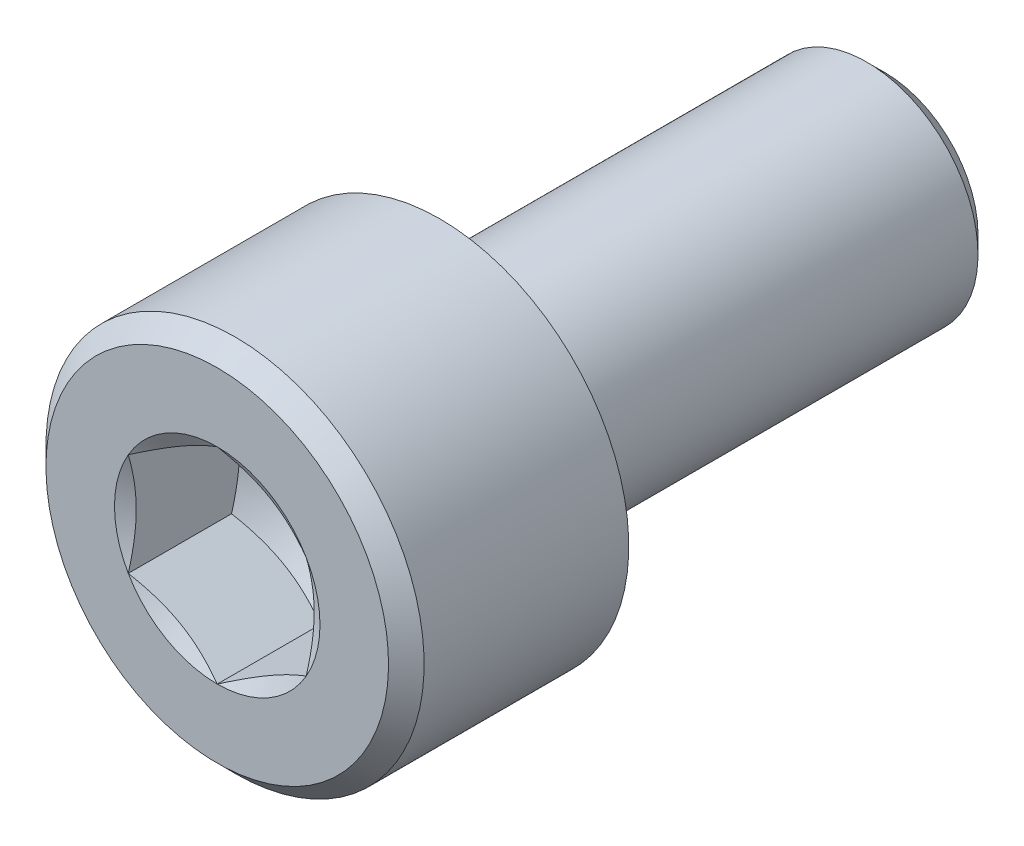
ISO-10303-21;
HEADER;
FILE_DESCRIPTION(('STEP AP214'),'2;1');
FILE_NAME('part.step','',(''),(''),'','','');
FILE_SCHEMA(('AUTOMOTIVE_DESIGN { 1 0 10303 214 1 1 1 1 }'));
ENDSEC;
DATA;
#1=APPLICATION_CONTEXT('core data for automotive mechanical design processes');
#2=APPLICATION_PROTOCOL_DEFINITION('international standard','automotive_design',2000,#1);
#3=PRODUCT_CONTEXT('',#1,'mechanical');
#4=PRODUCT('Part','Part','',(#3));
#5=PRODUCT_RELATED_PRODUCT_CATEGORY('part','',(#4));
#6=PRODUCT_DEFINITION_FORMATION('','',#4);
#7=PRODUCT_DEFINITION_CONTEXT('part definition',#1,'design');
#8=PRODUCT_DEFINITION('design','',#6,#7);
#9=PRODUCT_DEFINITION_SHAPE('','',#8);
#10=(LENGTH_UNIT() NAMED_UNIT(*) SI_UNIT(.MILLI.,.METRE.));
#11=(NAMED_UNIT(*) PLANE_ANGLE_UNIT() SI_UNIT($,.RADIAN.));
#12=(NAMED_UNIT(*) SI_UNIT($,.STERADIAN.) SOLID_ANGLE_UNIT());
#13=UNCERTAINTY_MEASURE_WITH_UNIT(LENGTH_MEASURE(1.E-05),#10,'distance_accuracy_value','');
#14=(GEOMETRIC_REPRESENTATION_CONTEXT(3) GLOBAL_UNCERTAINTY_ASSIGNED_CONTEXT((#13)) GLOBAL_UNIT_ASSIGNED_CONTEXT((#10,
#11,#12)) REPRESENTATION_CONTEXT('',''));
#15=CARTESIAN_POINT('',(0.,0.,0.));
#16=DIRECTION('',(0.,0.,1.));
#17=DIRECTION('',(1.,0.,0.));
#18=AXIS2_PLACEMENT_3D('',#15,#16,#17);
#19=CARTESIAN_POINT('',(0.,4.25,5.));
#20=DIRECTION('',(0.,0.,-1.));
#21=DIRECTION('',(0.,1.,0.));
#22=AXIS2_PLACEMENT_3D('',#19,#20,#21);
#23=PLANE('',#22);
#24=CARTESIAN_POINT('',(0.,0.,5.));
#25=DIRECTION('',(0.,0.,-1.));
#26=DIRECTION('',(0.,1.,0.));
#27=AXIS2_PLACEMENT_3D('',#24,#25,#26);
#28=CIRCLE('',#27,3.85);
#29=CARTESIAN_POINT('',(0.,3.85,5.));
#30=VERTEX_POINT('',#29);
#31=EDGE_CURVE('E283',#30,#30,#28,.F.);
#32=ORIENTED_EDGE('',*,*,#31,.T.);
#33=EDGE_LOOP('',(#32));
#34=FACE_BOUND('',#33,.T.);
#35=CARTESIAN_POINT('',(0.,0.,5.));
#36=DIRECTION('',(0.,0.,-1.));
#37=DIRECTION('',(0.,1.,0.));
#38=AXIS2_PLACEMENT_3D('',#35,#36,#37);
#39=CIRCLE('',#38,2.3094010767585);
#40=CARTESIAN_POINT('',(0.,2.3094010767585,5.));
#41=VERTEX_POINT('',#40);
#42=CARTESIAN_POINT('',(-2.,1.15470053837925,5.));
#43=VERTEX_POINT('',#42);
#44=EDGE_CURVE('E107',#41,#43,#39,.F.);
#45=ORIENTED_EDGE('',*,*,#44,.F.);
#46=CARTESIAN_POINT('',(2.,1.15470053837925,5.));
#47=VERTEX_POINT('',#46);
#48=EDGE_CURVE('E96',#47,#41,#39,.F.);
#49=ORIENTED_EDGE('',*,*,#48,.F.);
#50=CARTESIAN_POINT('',(2.,-1.15470053837925,5.));
#51=VERTEX_POINT('',#50);
#52=EDGE_CURVE('E105',#51,#47,#39,.F.);
#53=ORIENTED_EDGE('',*,*,#52,.F.);
#54=CARTESIAN_POINT('',(0.,-2.3094010767585,5.));
#55=VERTEX_POINT('',#54);
#56=EDGE_CURVE('E448',#55,#51,#39,.F.);
#57=ORIENTED_EDGE('',*,*,#56,.F.);
#58=CARTESIAN_POINT('',(-2.,-1.15470053838001,4.99999999999948));
#59=VERTEX_POINT('',#58);
#60=EDGE_CURVE('E135',#59,#55,#39,.F.);
#61=ORIENTED_EDGE('',*,*,#60,.F.);
#62=EDGE_CURVE('E134',#43,#59,#39,.F.);
#63=ORIENTED_EDGE('',*,*,#62,.F.);
#64=EDGE_LOOP('',(#45,#49,#53,#57,#61,#63));
#65=FACE_BOUND('',#64,.T.);
#66=ADVANCED_FACE('F40',(#34,#65),#23,.F.);
#67=CARTESIAN_POINT('',(0.,2.5,0.));
#68=DIRECTION('',(0.,0.,1.));
#69=DIRECTION('',(0.,-1.,0.));
#70=AXIS2_PLACEMENT_3D('',#67,#68,#69);
#71=PLANE('',#70);
#72=CARTESIAN_POINT('',(0.,0.,0.));
#73=DIRECTION('',(0.,0.,1.));
#74=DIRECTION('',(0.,-1.,0.));
#75=AXIS2_PLACEMENT_3D('',#72,#73,#74);
#76=CIRCLE('',#75,2.7);
#77=CARTESIAN_POINT('',(0.,-2.7,0.));
#78=VERTEX_POINT('',#77);
#79=EDGE_CURVE('E48',#78,#78,#76,.T.);
#80=ORIENTED_EDGE('',*,*,#79,.T.);
#81=EDGE_LOOP('',(#80));
#82=FACE_BOUND('',#81,.T.);
#83=CARTESIAN_POINT('',(0.,0.,0.));
#84=DIRECTION('',(0.,0.,1.));
#85=DIRECTION('',(0.,-1.,0.));
#86=AXIS2_PLACEMENT_3D('',#83,#84,#85);
#87=CIRCLE('',#86,4.25);
#88=CARTESIAN_POINT('',(0.,-4.25,0.));
#89=VERTEX_POINT('',#88);
#90=EDGE_CURVE('E427',#89,#89,#87,.T.);
#91=ORIENTED_EDGE('',*,*,#90,.F.);
#92=EDGE_LOOP('',(#91));
#93=FACE_BOUND('',#92,.T.);
#94=ADVANCED_FACE('F245',(#82,#93),#71,.F.);
#95=CARTESIAN_POINT('',(0.,0.,5.));
#96=DIRECTION('',(0.,0.,1.));
#97=DIRECTION('',(0.,-1.,0.));
#98=AXIS2_PLACEMENT_3D('',#95,#96,#97);
#99=CYLINDRICAL_SURFACE('',#98,2.5);
#100=CARTESIAN_POINT('',(0.,0.,-0.2));
#101=DIRECTION('',(0.,0.,1.));
#102=DIRECTION('',(0.,-1.,0.));
#103=AXIS2_PLACEMENT_3D('',#100,#101,#102);
#104=CIRCLE('',#103,2.5);
#105=CARTESIAN_POINT('',(0.,-2.5,-0.2));
#106=VERTEX_POINT('',#105);
#107=EDGE_CURVE('E12',#106,#106,#104,.F.);
#108=ORIENTED_EDGE('',*,*,#107,.T.);
#109=EDGE_LOOP('',(#108));
#110=FACE_BOUND('',#109,.T.);
#111=CARTESIAN_POINT('',(0.,0.,-9.6));
#112=DIRECTION('',(0.,0.,1.));
#113=DIRECTION('',(0.,-1.,0.));
#114=AXIS2_PLACEMENT_3D('',#111,#112,#113);
#115=CIRCLE('',#114,2.5);
#116=CARTESIAN_POINT('',(0.,-2.5,-9.6));
#117=VERTEX_POINT('',#116);
#118=EDGE_CURVE('E277',#117,#117,#115,.T.);
#119=ORIENTED_EDGE('',*,*,#118,.T.);
#120=EDGE_LOOP('',(#119));
#121=FACE_BOUND('',#120,.T.);
#122=ADVANCED_FACE('F250',(#110,#121),#99,.T.);
#123=CARTESIAN_POINT('',(0.,0.,-10.));
#124=DIRECTION('',(0.,0.,1.));
#125=DIRECTION('',(0.,-1.,0.));
#126=AXIS2_PLACEMENT_3D('',#123,#124,#125);
#127=PLANE('',#126);
#128=CARTESIAN_POINT('',(0.,0.,-10.));
#129=DIRECTION('',(0.,0.,1.));
#130=DIRECTION('',(0.,-1.,0.));
#131=AXIS2_PLACEMENT_3D('',#128,#129,#130);
#132=CIRCLE('',#131,2.1);
#133=CARTESIAN_POINT('',(0.,-2.1,-10.));
#134=VERTEX_POINT('',#133);
#135=EDGE_CURVE('E117',#134,#134,#132,.F.);
#136=ORIENTED_EDGE('',*,*,#135,.T.);
#137=EDGE_LOOP('',(#136));
#138=FACE_BOUND('',#137,.T.);
#139=ADVANCED_FACE('F255',(#138),#127,.F.);
#140=CARTESIAN_POINT('',(0.,0.,5.));
#141=DIRECTION('',(0.,0.,1.));
#142=DIRECTION('',(0.,-1.,0.));
#143=AXIS2_PLACEMENT_3D('',#140,#141,#142);
#144=CYLINDRICAL_SURFACE('',#143,4.25);
#145=CARTESIAN_POINT('',(0.,0.,4.6));
#146=DIRECTION('',(0.,0.,-1.));
#147=DIRECTION('',(0.,1.,0.));
#148=AXIS2_PLACEMENT_3D('',#145,#146,#147);
#149=CIRCLE('',#148,4.25);
#150=CARTESIAN_POINT('',(0.,4.25,4.6));
#151=VERTEX_POINT('',#150);
#152=EDGE_CURVE('E279',#151,#151,#149,.T.);
#153=ORIENTED_EDGE('',*,*,#152,.T.);
#154=EDGE_LOOP('',(#153));
#155=FACE_BOUND('',#154,.T.);
#156=ORIENTED_EDGE('',*,*,#90,.T.);
#157=EDGE_LOOP('',(#156));
#158=FACE_BOUND('',#157,.T.);
#159=ADVANCED_FACE('F169',(#155,#158),#144,.T.);
#160=CARTESIAN_POINT('',(0.,0.,5.));
#161=DIRECTION('',(0.,0.,-1.));
#162=DIRECTION('',(0.,1.,0.));
#163=AXIS2_PLACEMENT_3D('',#160,#161,#162);
#164=CONICAL_SURFACE('',#163,3.85,0.785398163397448);
#165=ORIENTED_EDGE('',*,*,#152,.F.);
#166=EDGE_LOOP('',(#165));
#167=FACE_BOUND('',#166,.T.);
#168=ORIENTED_EDGE('',*,*,#31,.F.);
#169=EDGE_LOOP('',(#168));
#170=FACE_BOUND('',#169,.T.);
#171=ADVANCED_FACE('F262',(#167,#170),#164,.T.);
#172=CARTESIAN_POINT('',(0.,0.,-9.6));
#173=DIRECTION('',(0.,0.,1.));
#174=DIRECTION('',(0.,-1.,0.));
#175=AXIS2_PLACEMENT_3D('',#172,#173,#174);
#176=CONICAL_SURFACE('',#175,2.5,0.785398163397448);
#177=ORIENTED_EDGE('',*,*,#135,.F.);
#178=EDGE_LOOP('',(#177));
#179=FACE_BOUND('',#178,.T.);
#180=ORIENTED_EDGE('',*,*,#118,.F.);
#181=EDGE_LOOP('',(#180));
#182=FACE_BOUND('',#181,.T.);
#183=ADVANCED_FACE('F264',(#179,#182),#176,.T.);
#184=CARTESIAN_POINT('',(0.,0.,4.82136720504592));
#185=DIRECTION('',(0.,0.,1.));
#186=DIRECTION('',(0.,-1.,0.));
#187=AXIS2_PLACEMENT_3D('',#184,#185,#186);
#188=CONICAL_SURFACE('',#187,2.,1.04719755119659);
#189=ORIENTED_EDGE('',*,*,#44,.T.);
#190=CARTESIAN_POINT('',(-2.0002,1.15458506832541,5.00006667166642));
#191=CARTESIAN_POINT('',(-1.91230873709994,1.20532911262018,4.9707567411466));
#192=CARTESIAN_POINT('',(-1.82365880552641,1.2565111744778,4.94410005702638));
#193=CARTESIAN_POINT('',(-1.6448237530022,1.35976164019319,4.89756969606664));
#194=CARTESIAN_POINT('',(-1.55463545349496,1.41183187919145,4.8777124814287));
#195=CARTESIAN_POINT('',(-1.37537661423669,1.51532701829183,4.84680066906917));
#196=CARTESIAN_POINT('',(-1.28633366177369,1.56673599086578,4.83554035664445));
#197=CARTESIAN_POINT('',(-1.10782860221495,1.66979593505373,4.82209586764056));
#198=CARTESIAN_POINT('',(-1.01836714429604,1.72144653186531,4.81990055999939));
#199=CARTESIAN_POINT('',(-0.851191646451199,1.81796535054794,4.82445819437657));
#200=CARTESIAN_POINT('',(-0.773452629734214,1.86284799277603,4.83009207973293));
#201=CARTESIAN_POINT('',(-0.618481085463865,1.95232085557725,4.84795110030674));
#202=CARTESIAN_POINT('',(-0.5412490942588,1.99691076648954,4.86018234106936));
#203=CARTESIAN_POINT('',(-0.385957813517798,2.08656822922816,4.89076064191353));
#204=CARTESIAN_POINT('',(-0.307918186892619,2.13162442866767,4.90923737211163));
#205=CARTESIAN_POINT('',(-0.153003134307864,2.221064675979,4.95117272325877));
#206=CARTESIAN_POINT('',(-0.0761257223768791,2.26544987045196,4.97462148553823));
#207=CARTESIAN_POINT('',(0.000200000000000249,2.30951654681234,5.00006667166642));
#208=B_SPLINE_CURVE_WITH_KNOTS('',3,(#190,#191,#192,#193,#194,#195,#196,#197,#198,#199,#200,
#201,#202,#203,#204,#205,#206,#207),.UNSPECIFIED.,.F.,.F.,(4,2,2,2,2,2,2,2,4),(0.,
0.317031824695611,0.634825876346565,0.944753967652638,1.25430138000371,1.52387047293094,
1.79368946861028,2.06949491027634,2.34475850821472),.UNSPECIFIED.);
#209=EDGE_CURVE('E111',#43,#41,#208,.T.);
#210=ORIENTED_EDGE('',*,*,#209,.T.);
#211=EDGE_LOOP('',(#189,#210));
#212=FACE_BOUND('',#211,.T.);
#213=ADVANCED_FACE('F112',(#212),#188,.F.);
#214=ORIENTED_EDGE('',*,*,#62,.T.);
#215=CARTESIAN_POINT('',(-2.,-3.06243599497982,5.77842061566642));
#216=CARTESIAN_POINT('',(-2.,-2.97462468513237,5.73598534037855));
#217=CARTESIAN_POINT('',(-2.,-2.8866057604461,5.69397190692429));
#218=CARTESIAN_POINT('',(-2.,-2.71004042392081,5.61102977847017));
#219=CARTESIAN_POINT('',(-2.,-2.62149392396137,5.57010127128071));
#220=CARTESIAN_POINT('',(-2.,-2.44328285837027,5.48935443652405));
#221=CARTESIAN_POINT('',(-2.,-2.35361479423054,5.44954380239757));
#222=CARTESIAN_POINT('',(-2.,-2.17354167395326,5.37163249793622));
#223=CARTESIAN_POINT('',(-2.,-2.08313665652268,5.33353173846879));
#224=CARTESIAN_POINT('',(-2.,-1.90031404940518,5.25903866540815));
#225=CARTESIAN_POINT('',(-2.,-1.80788540023466,5.22267334527037));
#226=CARTESIAN_POINT('',(-2.,-1.62195694964792,5.15279841056111));
#227=CARTESIAN_POINT('',(-2.,-1.52845725096689,5.11928852465543));
#228=CARTESIAN_POINT('',(-2.,-1.34040158791164,5.05601308267316));
#229=CARTESIAN_POINT('',(-2.,-1.24584820361364,5.02623993698969));
#230=CARTESIAN_POINT('',(-2.,-1.05539728812572,4.97140886877109));
#231=CARTESIAN_POINT('',(-2.,-0.959500192348852,4.9463494551145));
#232=CARTESIAN_POINT('',(-2.,-0.766296107056456,4.90216265730743));
#233=CARTESIAN_POINT('',(-2.,-0.668988749343329,4.88303685263621));
#234=CARTESIAN_POINT('',(-2.,-0.473201573751928,4.85200411839497));
#235=CARTESIAN_POINT('',(-2.,-0.374721754837131,4.84009719520736));
#236=CARTESIAN_POINT('',(-2.,-0.177725213014713,4.82455887040561));
#237=CARTESIAN_POINT('',(-2.,-0.0792127464698447,4.82087507810294));
#238=CARTESIAN_POINT('',(-2.,0.117733134481305,4.82196641552875));
#239=CARTESIAN_POINT('',(-2.,0.216166562770808,4.82673934949201));
#240=CARTESIAN_POINT('',(-2.,0.454297223247877,4.84809151895791));
#241=CARTESIAN_POINT('',(-2.,0.593620477818274,4.86885014693494));
#242=CARTESIAN_POINT('',(-2.,0.869689306254475,4.92356669931653));
#243=CARTESIAN_POINT('',(-2.,1.0064316481799,4.95754015317004));
#244=CARTESIAN_POINT('',(-2.,1.21108706615361,5.01612615070118));
#245=CARTESIAN_POINT('',(-2.,1.28004655189467,5.03722438207838));
#246=CARTESIAN_POINT('',(-2.,1.41724192464536,5.08150928917413));
#247=CARTESIAN_POINT('',(-2.,1.48547827495712,5.10469452442695));
#248=CARTESIAN_POINT('',(-2.,1.62094688255316,5.15267011301775));
#249=CARTESIAN_POINT('',(-2.,1.68818262968716,5.17745069711938));
#250=CARTESIAN_POINT('',(-2.,1.82213246587595,5.22846635273238));
#251=CARTESIAN_POINT('',(-2.,1.88884633148524,5.25470201209809));
#252=CARTESIAN_POINT('',(-2.,1.95531849493301,5.28152170831665));
#253=B_SPLINE_CURVE_WITH_KNOTS('',3,(#215,#216,#217,#218,#219,#220,#221,#222,#223,#224,#225,
#226,#227,#228,#229,#230,#231,#232,#233,#234,#235,#236,#237,#238,#239,#240,#241,#242,#243,#244,
#245,#246,#247,#248,#249,#250,#251,#252),.UNSPECIFIED.,.F.,.F.,(4,2,2,2,2,2,2,2,2,2,2,2,2,2,2,2,
2,2,4),(0.,0.292585896266147,0.585222115299657,0.879532973229982,1.17382847142418,
1.47176772581364,1.76967863724015,2.06697432467472,2.36417580814409,2.66145633652598,
2.95873712774083,3.25411843045697,3.54942304948623,3.97114178181696,4.39335760296185,
4.60967655565112,4.82584733174414,5.04080135347748,5.25584285892494),.UNSPECIFIED.);
#254=EDGE_CURVE('E227',#59,#43,#253,.T.);
#255=ORIENTED_EDGE('',*,*,#254,.T.);
#256=EDGE_LOOP('',(#214,#255));
#257=FACE_BOUND('',#256,.T.);
#258=ADVANCED_FACE('F271',(#257),#188,.F.);
#259=ORIENTED_EDGE('',*,*,#60,.T.);
#260=CARTESIAN_POINT('',(0.000200000000000642,-2.30951654681234,5.00006667166642));
#261=CARTESIAN_POINT('',(-0.0876912629000597,-2.25877250251757,4.9707567411466));
#262=CARTESIAN_POINT('',(-0.176341194473591,-2.20759044065995,4.94410005702638));
#263=CARTESIAN_POINT('',(-0.355176246997802,-2.10433997494456,4.89756969606664));
#264=CARTESIAN_POINT('',(-0.445364546505037,-2.0522697359463,4.8777124814287));
#265=CARTESIAN_POINT('',(-0.624623385763307,-1.94877459684592,4.84680066906917));
#266=CARTESIAN_POINT('',(-0.713666338226305,-1.89736562427197,4.83554035664445));
#267=CARTESIAN_POINT('',(-0.892171397785044,-1.79430568008402,4.82209586764056));
#268=CARTESIAN_POINT('',(-0.981632855703959,-1.74265508327244,4.81990055999938));
#269=CARTESIAN_POINT('',(-1.1488083535488,-1.64613626458981,4.82445819437656));
#270=CARTESIAN_POINT('',(-1.22654737026578,-1.60125362236172,4.83009207973293));
#271=CARTESIAN_POINT('',(-1.38151891453613,-1.51178075956051,4.84795110030675));
#272=CARTESIAN_POINT('',(-1.4587509057412,-1.46719084864821,4.86018234106936));
#273=CARTESIAN_POINT('',(-1.6140421864822,-1.37753338590959,4.89076064191353));
#274=CARTESIAN_POINT('',(-1.69208181310738,-1.33247718647009,4.90923737211163));
#275=CARTESIAN_POINT('',(-1.84699686569213,-1.24303693915875,4.95117272325877));
#276=CARTESIAN_POINT('',(-1.92387427762312,-1.1986517446858,4.97462148553823));
#277=CARTESIAN_POINT('',(-2.0002,-1.15458506832541,5.00006667166642));
#278=B_SPLINE_CURVE_WITH_KNOTS('',3,(#260,#261,#262,#263,#264,#265,#266,#267,#268,#269,#270,
#271,#272,#273,#274,#275,#276,#277),.UNSPECIFIED.,.F.,.F.,(4,2,2,2,2,2,2,2,4),(0.,
0.317031824695611,0.634825876346565,0.944753967652638,1.25430138000371,1.52387047293094,
1.79368946861028,2.06949491027634,2.34475850821472),.UNSPECIFIED.);
#279=EDGE_CURVE('E221',#55,#59,#278,.T.);
#280=ORIENTED_EDGE('',*,*,#279,.T.);
#281=EDGE_LOOP('',(#259,#280));
#282=FACE_BOUND('',#281,.T.);
#283=ADVANCED_FACE('F370',(#282),#188,.F.);
#284=ORIENTED_EDGE('',*,*,#56,.T.);
#285=CARTESIAN_POINT('',(2.0002,-1.15458506832541,5.00006667166642));
#286=CARTESIAN_POINT('',(1.91230873709994,-1.20532911262018,4.9707567411466));
#287=CARTESIAN_POINT('',(1.82365880552641,-1.2565111744778,4.94410005702638));
#288=CARTESIAN_POINT('',(1.6448237530022,-1.35976164019319,4.89756969606664));
#289=CARTESIAN_POINT('',(1.55463545349496,-1.41183187919145,4.8777124814287));
#290=CARTESIAN_POINT('',(1.37537661423669,-1.51532701829183,4.84680066906917));
#291=CARTESIAN_POINT('',(1.28633366177369,-1.56673599086578,4.83554035664445));
#292=CARTESIAN_POINT('',(1.10782860221495,-1.66979593505373,4.82209586764056));
#293=CARTESIAN_POINT('',(1.01836714429604,-1.72144653186531,4.81990055999938));
#294=CARTESIAN_POINT('',(0.8511916464512,-1.81796535054794,4.82445819437656));
#295=CARTESIAN_POINT('',(0.773452629734215,-1.86284799277603,4.83009207973293));
#296=CARTESIAN_POINT('',(0.618481085463865,-1.95232085557725,4.84795110030675));
#297=CARTESIAN_POINT('',(0.5412490942588,-1.99691076648954,4.86018234106936));
#298=CARTESIAN_POINT('',(0.385957813517798,-2.08656822922816,4.89076064191353));
#299=CARTESIAN_POINT('',(0.30791818689262,-2.13162442866767,4.90923737211163));
#300=CARTESIAN_POINT('',(0.153003134307865,-2.221064675979,4.95117272325877));
#301=CARTESIAN_POINT('',(0.0761257223768798,-2.26544987045196,4.97462148553823));
#302=CARTESIAN_POINT('',(-0.00019999999999988,-2.30951654681234,5.00006667166642));
#303=B_SPLINE_CURVE_WITH_KNOTS('',3,(#285,#286,#287,#288,#289,#290,#291,#292,#293,#294,#295,
#296,#297,#298,#299,#300,#301,#302),.UNSPECIFIED.,.F.,.F.,(4,2,2,2,2,2,2,2,4),(0.,
0.31703182469561,0.634825876346564,0.944753967652637,1.25430138000371,1.52387047293094,
1.79368946861028,2.06949491027634,2.34475850821472),.UNSPECIFIED.);
#304=EDGE_CURVE('E60',#51,#55,#303,.T.);
#305=ORIENTED_EDGE('',*,*,#304,.T.);
#306=EDGE_LOOP('',(#284,#305));
#307=FACE_BOUND('',#306,.T.);
#308=ADVANCED_FACE('F363',(#307),#188,.F.);
#309=ORIENTED_EDGE('',*,*,#52,.T.);
#310=CARTESIAN_POINT('',(2.,-3.06243599497946,5.77842061566624));
#311=CARTESIAN_POINT('',(2.,-2.97462468513201,5.73598534037837));
#312=CARTESIAN_POINT('',(2.,-2.88660576044574,5.69397190692412));
#313=CARTESIAN_POINT('',(2.,-2.71004042392046,5.61102977847001));
#314=CARTESIAN_POINT('',(2.,-2.62149392396102,5.57010127128055));
#315=CARTESIAN_POINT('',(2.,-2.44328285836993,5.48935443652389));
#316=CARTESIAN_POINT('',(2.,-2.35361479423019,5.44954380239742));
#317=CARTESIAN_POINT('',(2.,-2.17354167395292,5.37163249793608));
#318=CARTESIAN_POINT('',(2.,-2.08313665652234,5.33353173846865));
#319=CARTESIAN_POINT('',(2.,-1.90031404940485,5.25903866540802));
#320=CARTESIAN_POINT('',(2.,-1.80788540023433,5.22267334527025));
#321=CARTESIAN_POINT('',(2.,-1.62195694964761,5.15279841056099));
#322=CARTESIAN_POINT('',(2.,-1.52845725096657,5.11928852465532));
#323=CARTESIAN_POINT('',(2.,-1.34040158791133,5.05601308267306));
#324=CARTESIAN_POINT('',(2.,-1.24584820361333,5.0262399369896));
#325=CARTESIAN_POINT('',(2.,-1.05539728812542,4.97140886877101));
#326=CARTESIAN_POINT('',(2.,-0.95950019234856,4.94634945511443));
#327=CARTESIAN_POINT('',(2.,-0.766296107056173,4.90216265730737));
#328=CARTESIAN_POINT('',(2.,-0.66898874934305,4.88303685263615));
#329=CARTESIAN_POINT('',(2.,-0.473201573751658,4.85200411839494));
#330=CARTESIAN_POINT('',(2.,-0.374721754836864,4.84009719520733));
#331=CARTESIAN_POINT('',(2.,-0.177725213014455,4.8245588704056));
#332=CARTESIAN_POINT('',(2.,-0.0792127464695917,4.82087507810294));
#333=CARTESIAN_POINT('',(2.,0.117733134481548,4.82196641552876));
#334=CARTESIAN_POINT('',(2.,0.216166562771047,4.82673934949203));
#335=CARTESIAN_POINT('',(2.,0.454297223248126,4.84809151895794));
#336=CARTESIAN_POINT('',(2.,0.593620477818539,4.86885014693498));
#337=CARTESIAN_POINT('',(2.,0.86968930625477,4.92356669931659));
#338=CARTESIAN_POINT('',(2.,1.00643164818021,4.95754015317012));
#339=CARTESIAN_POINT('',(2.,1.21108706615394,5.01612615070128));
#340=CARTESIAN_POINT('',(2.,1.28004655189501,5.03722438207848));
#341=CARTESIAN_POINT('',(2.,1.41724192464571,5.08150928917424));
#342=CARTESIAN_POINT('',(2.,1.48547827495748,5.10469452442707));
#343=CARTESIAN_POINT('',(2.,1.62094688255352,5.15267011301788));
#344=CARTESIAN_POINT('',(2.,1.68818262968754,5.17745069711952));
#345=CARTESIAN_POINT('',(2.,1.82213246587633,5.22846635273253));
#346=CARTESIAN_POINT('',(2.,1.88884633148564,5.25470201209824));
#347=CARTESIAN_POINT('',(2.,1.95531849493341,5.28152170831681));
#348=B_SPLINE_CURVE_WITH_KNOTS('',3,(#310,#311,#312,#313,#314,#315,#316,#317,#318,#319,#320,
#321,#322,#323,#324,#325,#326,#327,#328,#329,#330,#331,#332,#333,#334,#335,#336,#337,#338,#339,
#340,#341,#342,#343,#344,#345,#346,#347),.UNSPECIFIED.,.F.,.F.,(4,2,2,2,2,2,2,2,2,2,2,2,2,2,2,2,
2,2,4),(0.,0.292585896266136,0.585222115299634,0.879532973229949,1.17382847142413,
1.47176772581358,1.76967863724007,2.06697432467463,2.36417580814398,2.66145633652585,
2.95873712774069,3.25411843045681,3.54942304948606,3.97114178181683,4.39335760296178,
4.60967655565108,4.82584733174412,5.04080135347748,5.25584285892497),.UNSPECIFIED.);
#349=EDGE_CURVE('E54',#47,#51,#348,.F.);
#350=ORIENTED_EDGE('',*,*,#349,.T.);
#351=EDGE_LOOP('',(#309,#350));
#352=FACE_BOUND('',#351,.T.);
#353=ADVANCED_FACE('F356',(#352),#188,.F.);
#354=ORIENTED_EDGE('',*,*,#48,.T.);
#355=CARTESIAN_POINT('',(-0.000200000000000006,2.30951654681234,5.00006667166642));
#356=CARTESIAN_POINT('',(0.0876912629000602,2.25877250251757,4.9707567411466));
#357=CARTESIAN_POINT('',(0.176341194473592,2.20759044065995,4.94410005702638));
#358=CARTESIAN_POINT('',(0.355176246997803,2.10433997494456,4.89756969606664));
#359=CARTESIAN_POINT('',(0.445364546505038,2.0522697359463,4.8777124814287));
#360=CARTESIAN_POINT('',(0.624623385763307,1.94877459684592,4.84680066906917));
#361=CARTESIAN_POINT('',(0.713666338226305,1.89736562427197,4.83554035664445));
#362=CARTESIAN_POINT('',(0.892171397785045,1.79430568008402,4.82209586764056));
#363=CARTESIAN_POINT('',(0.98163285570396,1.74265508327244,4.81990055999938));
#364=CARTESIAN_POINT('',(1.1488083535488,1.64613626458981,4.82445819437656));
#365=CARTESIAN_POINT('',(1.22654737026578,1.60125362236172,4.83009207973293));
#366=CARTESIAN_POINT('',(1.38151891453613,1.51178075956051,4.84795110030675));
#367=CARTESIAN_POINT('',(1.4587509057412,1.46719084864821,4.86018234106936));
#368=CARTESIAN_POINT('',(1.6140421864822,1.37753338590959,4.89076064191353));
#369=CARTESIAN_POINT('',(1.69208181310738,1.33247718647009,4.90923737211163));
#370=CARTESIAN_POINT('',(1.84699686569213,1.24303693915875,4.95117272325877));
#371=CARTESIAN_POINT('',(1.92387427762312,1.1986517446858,4.97462148553823));
#372=CARTESIAN_POINT('',(2.0002,1.15458506832541,5.00006667166642));
#373=B_SPLINE_CURVE_WITH_KNOTS('',3,(#355,#356,#357,#358,#359,#360,#361,#362,#363,#364,#365,
#366,#367,#368,#369,#370,#371,#372),.UNSPECIFIED.,.F.,.F.,(4,2,2,2,2,2,2,2,4),(0.,
0.317031824695611,0.634825876346565,0.944753967652638,1.25430138000371,1.52387047293094,
1.79368946861028,2.06949491027634,2.34475850821472),.UNSPECIFIED.);
#374=EDGE_CURVE('E100',#41,#47,#373,.T.);
#375=ORIENTED_EDGE('',*,*,#374,.T.);
#376=EDGE_LOOP('',(#354,#375));
#377=FACE_BOUND('',#376,.T.);
#378=ADVANCED_FACE('F98',(#377),#188,.F.);
#379=CARTESIAN_POINT('',(0.,0.,1.34529946162076));
#380=DIRECTION('',(0.,0.,1.));
#381=DIRECTION('',(1.,0.,0.));
#382=AXIS2_PLACEMENT_3D('',#379,#380,#381);
#383=CONICAL_SURFACE('',#382,0.,1.0471975511966);
#384=CARTESIAN_POINT('',(2.0002,-1.15458506832541,2.6786994666205));
#385=CARTESIAN_POINT('',(1.91230873709994,-1.20532911262018,2.64938953610068));
#386=CARTESIAN_POINT('',(1.82365880552641,-1.2565111744778,2.62273285198047));
#387=CARTESIAN_POINT('',(1.6448237530022,-1.35976164019319,2.57620249102072));
#388=CARTESIAN_POINT('',(1.55463545349496,-1.41183187919145,2.55634527638278));
#389=CARTESIAN_POINT('',(1.37537661423669,-1.51532701829183,2.52543346402325));
#390=CARTESIAN_POINT('',(1.2863336617737,-1.56673599086578,2.51417315159853));
#391=CARTESIAN_POINT('',(1.10782860221496,-1.66979593505373,2.50072866259464));
#392=CARTESIAN_POINT('',(1.01836714429604,-1.72144653186531,2.49853335495347));
#393=CARTESIAN_POINT('',(0.851191646451202,-1.81796535054794,2.50309098933065));
#394=CARTESIAN_POINT('',(0.773452629734216,-1.86284799277603,2.50872487468702));
#395=CARTESIAN_POINT('',(0.618481085463867,-1.95232085557725,2.52658389526083));
#396=CARTESIAN_POINT('',(0.541249094258802,-1.99691076648954,2.53881513602344));
#397=CARTESIAN_POINT('',(0.385957813517799,-2.08656822922816,2.56939343686761));
#398=CARTESIAN_POINT('',(0.307918186892621,-2.13162442866767,2.58787016706572));
#399=CARTESIAN_POINT('',(0.153003134307866,-2.221064675979,2.62980551821286));
#400=CARTESIAN_POINT('',(0.0761257223768804,-2.26544987045196,2.65325428049231));
#401=CARTESIAN_POINT('',(-0.000199999999999441,-2.30951654681234,2.6786994666205));
#402=B_SPLINE_CURVE_WITH_KNOTS('',3,(#384,#385,#386,#387,#388,#389,#390,#391,#392,#393,#394,
#395,#396,#397,#398,#399,#400,#401),.UNSPECIFIED.,.F.,.F.,(4,2,2,2,2,2,2,2,4),(0.,
0.317031824695609,0.634825876346563,0.944753967652635,1.25430138000371,1.52387047293094,
1.79368946861028,2.06949491027634,2.34475850821472),.UNSPECIFIED.);
#403=CARTESIAN_POINT('',(2.,-1.15470053837925,2.67863279495408));
#404=VERTEX_POINT('',#403);
#405=CARTESIAN_POINT('',(0.,-2.3094010767585,2.67863279495408));
#406=VERTEX_POINT('',#405);
#407=EDGE_CURVE('E183',#404,#406,#402,.T.);
#408=ORIENTED_EDGE('',*,*,#407,.F.);
#409=CARTESIAN_POINT('',(2.,-3.09766589688986,3.47411243358066));
#410=CARTESIAN_POINT('',(2.,-3.01028241939655,3.43173975646137));
#411=CARTESIAN_POINT('',(2.,-2.92269777793267,3.38977479085957));
#412=CARTESIAN_POINT('',(2.,-2.74701904024669,3.30688989917994));
#413=CARTESIAN_POINT('',(2.,-2.65892486572066,3.26597013925838));
#414=CARTESIAN_POINT('',(2.,-2.48166490935817,3.18519891948292));
#415=CARTESIAN_POINT('',(2.,-2.39249590280326,3.14535451202759));
#416=CARTESIAN_POINT('',(2.,-2.21344649829552,3.0673037237081));
#417=CARTESIAN_POINT('',(2.,-2.12356613451123,3.02909726472744));
#418=CARTESIAN_POINT('',(2.,-1.94019839739552,2.95362246923671));
#419=CARTESIAN_POINT('',(2.,-1.84668453517055,2.91641813635724));
#420=CARTESIAN_POINT('',(2.,-1.65856169471266,2.84483495885443));
#421=CARTESIAN_POINT('',(2.,-1.56395259486322,2.81045643151273));
#422=CARTESIAN_POINT('',(2.,-1.37366645381171,2.74542930985525));
#423=CARTESIAN_POINT('',(2.,-1.27799201855192,2.7147731666919));
#424=CARTESIAN_POINT('',(2.,-1.08527173144881,2.65817643886673));
#425=CARTESIAN_POINT('',(2.,-0.988226322735735,2.63223436646436));
#426=CARTESIAN_POINT('',(2.,-0.793180945862043,2.58643441102321));
#427=CARTESIAN_POINT('',(2.,-0.695187897149501,2.56654760809932));
#428=CARTESIAN_POINT('',(2.,-0.497989734604729,2.5340079436267));
#429=CARTESIAN_POINT('',(2.,-0.398784755522591,2.52135428519492));
#430=CARTESIAN_POINT('',(2.,-0.200942618073215,2.50445846320111));
#431=CARTESIAN_POINT('',(2.,-0.102314902141349,2.50010885410785));
#432=CARTESIAN_POINT('',(2.,0.0949508546380585,2.49989505942349));
#433=CARTESIAN_POINT('',(2.,0.193588895750506,2.50403138027959));
#434=CARTESIAN_POINT('',(2.,0.430262033195524,2.52377723822127));
#435=CARTESIAN_POINT('',(2.,0.56796545333694,2.54337653566193));
#436=CARTESIAN_POINT('',(2.,0.840894456119269,2.59568353158588));
#437=CARTESIAN_POINT('',(2.,0.976117095272142,2.62840586614256));
#438=CARTESIAN_POINT('',(2.,1.17854931270687,2.68512457406692));
#439=CARTESIAN_POINT('',(2.,1.24678566702572,2.70560069714677));
#440=CARTESIAN_POINT('',(2.,1.38254930921886,2.74865536952908));
#441=CARTESIAN_POINT('',(2.,1.45007699577436,2.77123265744046));
#442=CARTESIAN_POINT('',(2.,1.58451026050572,2.818143008733));
#443=CARTESIAN_POINT('',(2.,1.65141587834599,2.84247595929064));
#444=CARTESIAN_POINT('',(2.,1.78468205620061,2.89261356260926));
#445=CARTESIAN_POINT('',(2.,1.85104253822503,2.91841842189416));
#446=CARTESIAN_POINT('',(2.,2.07428469858915,3.00759877578933));
#447=CARTESIAN_POINT('',(2.,2.23003761005706,3.07379842437083));
#448=CARTESIAN_POINT('',(2.,2.5395480612678,3.21072813185971));
#449=CARTESIAN_POINT('',(2.,2.69330514813469,3.28145919811101));
#450=CARTESIAN_POINT('',(2.,2.99942825075468,3.42607112274145));
#451=CARTESIAN_POINT('',(2.,3.1517934599028,3.49995368227));
#452=CARTESIAN_POINT('',(2.,3.45543737017448,3.64992392861724));
#453=CARTESIAN_POINT('',(2.,3.60671602615543,3.72601170640153));
#454=CARTESIAN_POINT('',(2.,3.90879641551506,3.87996876360436));
#455=CARTESIAN_POINT('',(2.,4.05959627803999,3.95784170569949));
#456=CARTESIAN_POINT('',(2.,4.36056500588456,4.1147988390718));
#457=CARTESIAN_POINT('',(2.,4.51073386477036,4.19388304266124));
#458=CARTESIAN_POINT('',(2.,4.96040067831842,4.43244870770393));
#459=CARTESIAN_POINT('',(2.,5.25917084181834,4.59330088929033));
#460=CARTESIAN_POINT('',(2.,5.81178993423121,4.89352025025737));
#461=CARTESIAN_POINT('',(2.,6.06580574968527,5.03258165302964));
#462=CARTESIAN_POINT('',(2.,6.57322352039774,5.31188472150055));
#463=CARTESIAN_POINT('',(2.,6.82662540605178,5.45212651363821));
#464=CARTESIAN_POINT('',(2.,7.33190959579361,5.73286494003819));
#465=CARTESIAN_POINT('',(2.,7.58379383769158,5.87335809111063));
#466=CARTESIAN_POINT('',(2.,8.0871758252697,6.15496521849709));
#467=CARTESIAN_POINT('',(2.,8.33867361334444,6.29607911900655));
#468=CARTESIAN_POINT('',(2.,8.59004646940397,6.43741422684089));
#469=B_SPLINE_CURVE_WITH_KNOTS('',3,(#409,#410,#411,#412,#413,#414,#415,#416,#417,#418,#419,
#420,#421,#422,#423,#424,#425,#426,#427,#428,#429,#430,#431,#432,#433,#434,#435,#436,#437,#438,
#439,#440,#441,#442,#443,#444,#445,#446,#447,#448,#449,#450,#451,#452,#453,#454,#455,#456,#457,
#458,#459,#460,#461,#462,#463,#464,#465,#466,#467,#468),.UNSPECIFIED.,.F.,.F.,(4,2,2,2,2,2,2,2,
2,2,2,2,2,2,2,2,2,2,2,2,2,2,2,2,2,2,2,2,2,4),(0.,0.291348478518851,0.582742988011458,
0.875728433957773,1.16869989135998,1.47059346715262,1.77252089340736,2.07382541732281,
2.37503468504222,2.67478196254421,2.97449621020828,3.27030547410256,3.56613239264765,
3.98255576366473,4.39944486745095,4.6131457025043,4.82671906418695,5.04027871328402,
5.25386840105681,5.76145159660075,6.26914802317003,6.77712205665434,7.28511707405565,
7.79426904104232,8.30342618690352,9.32136266299684,10.1901285993081,11.0589888099835,
11.9242369596342,12.789382228286),.UNSPECIFIED.);
#470=CARTESIAN_POINT('',(2.,1.15470053837925,2.67863279495408));
#471=VERTEX_POINT('',#470);
#472=EDGE_CURVE('E190',#471,#404,#469,.F.);
#473=ORIENTED_EDGE('',*,*,#472,.F.);
#474=CARTESIAN_POINT('',(-0.000200000000000006,2.30951654681234,2.6786994666205));
#475=CARTESIAN_POINT('',(0.0876912629000596,2.25877250251757,2.64938953610068));
#476=CARTESIAN_POINT('',(0.176341194473591,2.20759044065995,2.62273285198047));
#477=CARTESIAN_POINT('',(0.355176246997802,2.10433997494456,2.57620249102072));
#478=CARTESIAN_POINT('',(0.445364546505036,2.0522697359463,2.55634527638278));
#479=CARTESIAN_POINT('',(0.624623385763305,1.94877459684592,2.52543346402325));
#480=CARTESIAN_POINT('',(0.713666338226303,1.89736562427197,2.51417315159853));
#481=CARTESIAN_POINT('',(0.892171397785042,1.79430568008402,2.50072866259464));
#482=CARTESIAN_POINT('',(0.981632855703957,1.74265508327244,2.49853335495347));
#483=CARTESIAN_POINT('',(1.1488083535488,1.64613626458981,2.50309098933065));
#484=CARTESIAN_POINT('',(1.22654737026578,1.60125362236172,2.50872487468702));
#485=CARTESIAN_POINT('',(1.38151891453613,1.51178075956051,2.52658389526083));
#486=CARTESIAN_POINT('',(1.4587509057412,1.46719084864821,2.53881513602344));
#487=CARTESIAN_POINT('',(1.6140421864822,1.37753338590959,2.56939343686761));
#488=CARTESIAN_POINT('',(1.69208181310738,1.33247718647009,2.58787016706572));
#489=CARTESIAN_POINT('',(1.84699686569213,1.24303693915875,2.62980551821286));
#490=CARTESIAN_POINT('',(1.92387427762312,1.1986517446858,2.65325428049231));
#491=CARTESIAN_POINT('',(2.0002,1.15458506832541,2.6786994666205));
#492=B_SPLINE_CURVE_WITH_KNOTS('',3,(#474,#475,#476,#477,#478,#479,#480,#481,#482,#483,#484,
#485,#486,#487,#488,#489,#490,#491),.UNSPECIFIED.,.F.,.F.,(4,2,2,2,2,2,2,2,4),(0.,
0.317031824695609,0.634825876346563,0.944753967652635,1.25430138000371,1.52387047293094,
1.79368946861028,2.06949491027634,2.34475850821472),.UNSPECIFIED.);
#493=CARTESIAN_POINT('',(0.,2.3094010767585,2.67863279495408));
#494=VERTEX_POINT('',#493);
#495=EDGE_CURVE('E197',#494,#471,#492,.T.);
#496=ORIENTED_EDGE('',*,*,#495,.F.);
#497=CARTESIAN_POINT('',(-2.0002,1.15458506832541,2.6786994666205));
#498=CARTESIAN_POINT('',(-1.91230873709994,1.20532911262018,2.64938953610068));
#499=CARTESIAN_POINT('',(-1.82365880552641,1.2565111744778,2.62273285198047));
#500=CARTESIAN_POINT('',(-1.6448237530022,1.35976164019319,2.57620249102072));
#501=CARTESIAN_POINT('',(-1.55463545349496,1.41183187919145,2.55634527638278));
#502=CARTESIAN_POINT('',(-1.37537661423669,1.51532701829183,2.52543346402325));
#503=CARTESIAN_POINT('',(-1.2863336617737,1.56673599086578,2.51417315159853));
#504=CARTESIAN_POINT('',(-1.10782860221496,1.66979593505373,2.50072866259464));
#505=CARTESIAN_POINT('',(-1.01836714429604,1.72144653186531,2.49853335495347));
#506=CARTESIAN_POINT('',(-0.851191646451201,1.81796535054794,2.50309098933065));
#507=CARTESIAN_POINT('',(-0.773452629734216,1.86284799277603,2.50872487468702));
#508=CARTESIAN_POINT('',(-0.618481085463867,1.95232085557725,2.52658389526083));
#509=CARTESIAN_POINT('',(-0.541249094258801,1.99691076648954,2.53881513602344));
#510=CARTESIAN_POINT('',(-0.385957813517799,2.08656822922816,2.56939343686761));
#511=CARTESIAN_POINT('',(-0.30791818689262,2.13162442866767,2.58787016706572));
#512=CARTESIAN_POINT('',(-0.153003134307865,2.221064675979,2.62980551821286));
#513=CARTESIAN_POINT('',(-0.0761257223768799,2.26544987045196,2.65325428049231));
#514=CARTESIAN_POINT('',(0.000199999999999944,2.30951654681234,2.6786994666205));
#515=B_SPLINE_CURVE_WITH_KNOTS('',3,(#497,#498,#499,#500,#501,#502,#503,#504,#505,#506,#507,
#508,#509,#510,#511,#512,#513,#514),.UNSPECIFIED.,.F.,.F.,(4,2,2,2,2,2,2,2,4),(0.,
0.31703182469561,0.634825876346563,0.944753967652635,1.25430138000371,1.52387047293094,
1.79368946861028,2.06949491027634,2.34475850821472),.UNSPECIFIED.);
#516=CARTESIAN_POINT('',(-2.,1.15470053837925,2.67863279495408));
#517=VERTEX_POINT('',#516);
#518=EDGE_CURVE('E128',#517,#494,#515,.T.);
#519=ORIENTED_EDGE('',*,*,#518,.F.);
#520=CARTESIAN_POINT('',(-2.,-3.09766589688986,3.47411243358066));
#521=CARTESIAN_POINT('',(-2.,-3.01028241939655,3.43173975646137));
#522=CARTESIAN_POINT('',(-2.,-2.92269777793266,3.38977479085957));
#523=CARTESIAN_POINT('',(-2.,-2.74701904024669,3.30688989917993));
#524=CARTESIAN_POINT('',(-2.,-2.65892486572066,3.26597013925838));
#525=CARTESIAN_POINT('',(-2.,-2.48166490935816,3.18519891948292));
#526=CARTESIAN_POINT('',(-2.,-2.39249590280326,3.14535451202759));
#527=CARTESIAN_POINT('',(-2.,-2.21344649829552,3.0673037237081));
#528=CARTESIAN_POINT('',(-2.,-2.12356613451123,3.02909726472744));
#529=CARTESIAN_POINT('',(-2.,-1.94019839739551,2.95362246923671));
#530=CARTESIAN_POINT('',(-2.,-1.84668453517055,2.91641813635724));
#531=CARTESIAN_POINT('',(-2.,-1.65856169471266,2.84483495885443));
#532=CARTESIAN_POINT('',(-2.,-1.56395259486322,2.81045643151273));
#533=CARTESIAN_POINT('',(-2.,-1.37366645381171,2.74542930985525));
#534=CARTESIAN_POINT('',(-2.,-1.27799201855192,2.7147731666919));
#535=CARTESIAN_POINT('',(-2.,-1.08527173144881,2.65817643886673));
#536=CARTESIAN_POINT('',(-2.,-0.988226322735735,2.63223436646436));
#537=CARTESIAN_POINT('',(-2.,-0.793180945862043,2.58643441102321));
#538=CARTESIAN_POINT('',(-2.,-0.695187897149501,2.56654760809932));
#539=CARTESIAN_POINT('',(-2.,-0.49798973460473,2.5340079436267));
#540=CARTESIAN_POINT('',(-2.,-0.398784755522591,2.52135428519491));
#541=CARTESIAN_POINT('',(-2.,-0.200942618073215,2.50445846320111));
#542=CARTESIAN_POINT('',(-2.,-0.10231490214135,2.50010885410785));
#543=CARTESIAN_POINT('',(-2.,0.0949508546380581,2.49989505942349));
#544=CARTESIAN_POINT('',(-2.,0.193588895750506,2.50403138027959));
#545=CARTESIAN_POINT('',(-2.,0.430262033195524,2.52377723822127));
#546=CARTESIAN_POINT('',(-2.,0.56796545333694,2.54337653566193));
#547=CARTESIAN_POINT('',(-2.,0.840894456119269,2.59568353158589));
#548=CARTESIAN_POINT('',(-2.,0.976117095272141,2.62840586614256));
#549=CARTESIAN_POINT('',(-2.,1.17854931270687,2.68512457406692));
#550=CARTESIAN_POINT('',(-2.,1.24678566702572,2.70560069714677));
#551=CARTESIAN_POINT('',(-2.,1.38254930921886,2.74865536952908));
#552=CARTESIAN_POINT('',(-2.,1.45007699577436,2.77123265744046));
#553=CARTESIAN_POINT('',(-2.,1.58451026050572,2.818143008733));
#554=CARTESIAN_POINT('',(-2.,1.65141587834599,2.84247595929064));
#555=CARTESIAN_POINT('',(-2.,1.78468205620061,2.89261356260926));
#556=CARTESIAN_POINT('',(-2.,1.85104253822503,2.91841842189416));
#557=CARTESIAN_POINT('',(-2.,2.07428469858916,3.00759877578933));
#558=CARTESIAN_POINT('',(-2.,2.23003761005706,3.07379842437083));
#559=CARTESIAN_POINT('',(-2.,2.5395480612678,3.21072813185971));
#560=CARTESIAN_POINT('',(-2.,2.69330514813469,3.28145919811101));
#561=CARTESIAN_POINT('',(-2.,2.99942825075468,3.42607112274145));
#562=CARTESIAN_POINT('',(-2.,3.15179345990281,3.49995368227));
#563=CARTESIAN_POINT('',(-2.,3.45543737017448,3.64992392861724));
#564=CARTESIAN_POINT('',(-2.,3.60671602615543,3.72601170640153));
#565=CARTESIAN_POINT('',(-2.,3.90879641551506,3.87996876360437));
#566=CARTESIAN_POINT('',(-2.,4.05959627803999,3.95784170569949));
#567=CARTESIAN_POINT('',(-2.,4.36056500588456,4.1147988390718));
#568=CARTESIAN_POINT('',(-2.,4.51073386477036,4.19388304266124));
#569=CARTESIAN_POINT('',(-2.,4.96040067831842,4.43244870770393));
#570=CARTESIAN_POINT('',(-2.,5.25917084181834,4.59330088929033));
#571=CARTESIAN_POINT('',(-2.,5.81178993423121,4.89352025025737));
#572=CARTESIAN_POINT('',(-2.,6.06580574968527,5.03258165302964));
#573=CARTESIAN_POINT('',(-2.,6.57322352039774,5.31188472150055));
#574=CARTESIAN_POINT('',(-2.,6.82662540605178,5.45212651363821));
#575=CARTESIAN_POINT('',(-2.,7.33190959579361,5.73286494003819));
#576=CARTESIAN_POINT('',(-2.,7.58379383769158,5.87335809111063));
#577=CARTESIAN_POINT('',(-2.,8.08717582526971,6.15496521849709));
#578=CARTESIAN_POINT('',(-2.,8.33867361334445,6.29607911900655));
#579=CARTESIAN_POINT('',(-2.,8.59004646940397,6.43741422684089));
#580=B_SPLINE_CURVE_WITH_KNOTS('',3,(#520,#521,#522,#523,#524,#525,#526,#527,#528,#529,#530,
#531,#532,#533,#534,#535,#536,#537,#538,#539,#540,#541,#542,#543,#544,#545,#546,#547,#548,#549,
#550,#551,#552,#553,#554,#555,#556,#557,#558,#559,#560,#561,#562,#563,#564,#565,#566,#567,#568,
#569,#570,#571,#572,#573,#574,#575,#576,#577,#578,#579),.UNSPECIFIED.,.F.,.F.,(4,2,2,2,2,2,2,2,
2,2,2,2,2,2,2,2,2,2,2,2,2,2,2,2,2,2,2,2,2,4),(0.,0.291348478518851,0.582742988011459,
0.875728433957773,1.16869989135998,1.47059346715262,1.77252089340736,2.07382541732281,
2.37503468504221,2.67478196254421,2.97449621020828,3.27030547410256,3.56613239264764,
3.98255576366473,4.39944486745095,4.6131457025043,4.82671906418695,5.04027871328402,
5.25386840105681,5.76145159660075,6.26914802317003,6.77712205665435,7.28511707405565,
7.79426904104232,8.30342618690352,9.32136266299684,10.1901285993081,11.0589888099835,
11.9242369596342,12.789382228286),.UNSPECIFIED.);
#581=CARTESIAN_POINT('',(-2.,-1.1547005383796,2.67863279495385));
#582=VERTEX_POINT('',#581);
#583=EDGE_CURVE('E144',#582,#517,#580,.T.);
#584=ORIENTED_EDGE('',*,*,#583,.F.);
#585=CARTESIAN_POINT('',(0.0002000000000003,-2.30951654681234,2.6786994666205));
#586=CARTESIAN_POINT('',(-0.0876912629000596,-2.25877250251757,2.64938953610068));
#587=CARTESIAN_POINT('',(-0.176341194473591,-2.20759044065995,2.62273285198047));
#588=CARTESIAN_POINT('',(-0.355176246997801,-2.10433997494456,2.57620249102072));
#589=CARTESIAN_POINT('',(-0.445364546505036,-2.0522697359463,2.55634527638278));
#590=CARTESIAN_POINT('',(-0.624623385763305,-1.94877459684592,2.52543346402325));
#591=CARTESIAN_POINT('',(-0.713666338226303,-1.89736562427197,2.51417315159853));
#592=CARTESIAN_POINT('',(-0.892171397785042,-1.79430568008402,2.50072866259464));
#593=CARTESIAN_POINT('',(-0.981632855703957,-1.74265508327244,2.49853335495347));
#594=CARTESIAN_POINT('',(-1.1488083535488,-1.64613626458981,2.50309098933065));
#595=CARTESIAN_POINT('',(-1.22654737026578,-1.60125362236172,2.50872487468702));
#596=CARTESIAN_POINT('',(-1.38151891453613,-1.51178075956051,2.52658389526083));
#597=CARTESIAN_POINT('',(-1.4587509057412,-1.46719084864821,2.53881513602344));
#598=CARTESIAN_POINT('',(-1.6140421864822,-1.37753338590959,2.56939343686761));
#599=CARTESIAN_POINT('',(-1.69208181310738,-1.33247718647009,2.58787016706572));
#600=CARTESIAN_POINT('',(-1.84699686569213,-1.24303693915875,2.62980551821286));
#601=CARTESIAN_POINT('',(-1.92387427762312,-1.1986517446858,2.65325428049231));
#602=CARTESIAN_POINT('',(-2.0002,-1.15458506832541,2.6786994666205));
#603=B_SPLINE_CURVE_WITH_KNOTS('',3,(#585,#586,#587,#588,#589,#590,#591,#592,#593,#594,#595,
#596,#597,#598,#599,#600,#601,#602),.UNSPECIFIED.,.F.,.F.,(4,2,2,2,2,2,2,2,4),(0.,
0.31703182469561,0.634825876346563,0.944753967652635,1.25430138000371,1.52387047293094,
1.79368946861028,2.06949491027634,2.34475850821472),.UNSPECIFIED.);
#604=EDGE_CURVE('E153',#406,#582,#603,.T.);
#605=ORIENTED_EDGE('',*,*,#604,.F.);
#606=EDGE_LOOP('',(#408,#473,#496,#519,#584,#605));
#607=FACE_BOUND('',#606,.T.);
#608=CARTESIAN_POINT('',(0.,0.,1.34529946162076));
#609=VERTEX_POINT('',#608);
#610=VERTEX_LOOP('',#609);
#611=FACE_BOUND('',#610,.T.);
#612=ADVANCED_FACE('F163',(#607,#611),#383,.F.);
#613=CARTESIAN_POINT('',(0.,2.3094010767585,-10.001));
#614=DIRECTION('',(-0.5,0.866025403784439,0.));
#615=DIRECTION('',(-0.866025403784439,-0.5,0.));
#616=AXIS2_PLACEMENT_3D('',#613,#614,#615);
#617=PLANE('',#616);
#618=ORIENTED_EDGE('',*,*,#209,.F.);
#619=DIRECTION('',(0.,0.,1.));
#620=VECTOR('',#619,1.);
#621=CARTESIAN_POINT('',(-2.,1.15470053837925,-10.001));
#622=LINE('',#621,#620);
#623=EDGE_CURVE('E129',#517,#43,#622,.T.);
#624=ORIENTED_EDGE('',*,*,#623,.F.);
#625=ORIENTED_EDGE('',*,*,#518,.T.);
#626=DIRECTION('',(0.,0.,1.));
#627=VECTOR('',#626,1.);
#628=CARTESIAN_POINT('',(0.,2.3094010767585,-10.001));
#629=LINE('',#628,#627);
#630=EDGE_CURVE('E122',#494,#41,#629,.T.);
#631=ORIENTED_EDGE('',*,*,#630,.T.);
#632=EDGE_LOOP('',(#618,#624,#625,#631));
#633=FACE_BOUND('',#632,.T.);
#634=ADVANCED_FACE('F127',(#633),#617,.F.);
#635=CARTESIAN_POINT('',(-2.,1.15470053837925,-10.001));
#636=DIRECTION('',(-1.,0.,0.));
#637=DIRECTION('',(0.,-1.,0.));
#638=AXIS2_PLACEMENT_3D('',#635,#636,#637);
#639=PLANE('',#638);
#640=ORIENTED_EDGE('',*,*,#254,.F.);
#641=DIRECTION('',(0.,0.,1.));
#642=VECTOR('',#641,1.);
#643=CARTESIAN_POINT('',(-2.,-1.15470053837925,-10.001));
#644=LINE('',#643,#642);
#645=EDGE_CURVE('E440',#582,#59,#644,.T.);
#646=ORIENTED_EDGE('',*,*,#645,.F.);
#647=ORIENTED_EDGE('',*,*,#583,.T.);
#648=ORIENTED_EDGE('',*,*,#623,.T.);
#649=EDGE_LOOP('',(#640,#646,#647,#648));
#650=FACE_BOUND('',#649,.T.);
#651=ADVANCED_FACE('F160',(#650),#639,.F.);
#652=CARTESIAN_POINT('',(-2.,-1.15470053837925,-10.001));
#653=DIRECTION('',(-0.5,-0.866025403784439,0.));
#654=DIRECTION('',(0.866025403784439,-0.5,0.));
#655=AXIS2_PLACEMENT_3D('',#652,#653,#654);
#656=PLANE('',#655);
#657=ORIENTED_EDGE('',*,*,#279,.F.);
#658=DIRECTION('',(0.,0.,1.));
#659=VECTOR('',#658,1.);
#660=CARTESIAN_POINT('',(0.,-2.3094010767585,-10.001));
#661=LINE('',#660,#659);
#662=EDGE_CURVE('E435',#406,#55,#661,.T.);
#663=ORIENTED_EDGE('',*,*,#662,.F.);
#664=ORIENTED_EDGE('',*,*,#604,.T.);
#665=ORIENTED_EDGE('',*,*,#645,.T.);
#666=EDGE_LOOP('',(#657,#663,#664,#665));
#667=FACE_BOUND('',#666,.T.);
#668=ADVANCED_FACE('F232',(#667),#656,.F.);
#669=CARTESIAN_POINT('',(0.,-2.3094010767585,-10.001));
#670=DIRECTION('',(0.5,-0.866025403784439,0.));
#671=DIRECTION('',(0.866025403784439,0.5,0.));
#672=AXIS2_PLACEMENT_3D('',#669,#670,#671);
#673=PLANE('',#672);
#674=ORIENTED_EDGE('',*,*,#304,.F.);
#675=DIRECTION('',(0.,0.,1.));
#676=VECTOR('',#675,1.);
#677=CARTESIAN_POINT('',(2.,-1.15470053837925,-10.001));
#678=LINE('',#677,#676);
#679=EDGE_CURVE('E434',#404,#51,#678,.T.);
#680=ORIENTED_EDGE('',*,*,#679,.F.);
#681=ORIENTED_EDGE('',*,*,#407,.T.);
#682=ORIENTED_EDGE('',*,*,#662,.T.);
#683=EDGE_LOOP('',(#674,#680,#681,#682));
#684=FACE_BOUND('',#683,.T.);
#685=ADVANCED_FACE('F206',(#684),#673,.F.);
#686=CARTESIAN_POINT('',(2.,-1.15470053837925,-10.001));
#687=DIRECTION('',(1.,0.,0.));
#688=DIRECTION('',(0.,0.,-1.));
#689=AXIS2_PLACEMENT_3D('',#686,#687,#688);
#690=PLANE('',#689);
#691=ORIENTED_EDGE('',*,*,#349,.F.);
#692=DIRECTION('',(0.,0.,1.));
#693=VECTOR('',#692,1.);
#694=CARTESIAN_POINT('',(2.,1.15470053837925,-10.001));
#695=LINE('',#694,#693);
#696=EDGE_CURVE('E124',#471,#47,#695,.T.);
#697=ORIENTED_EDGE('',*,*,#696,.F.);
#698=ORIENTED_EDGE('',*,*,#472,.T.);
#699=ORIENTED_EDGE('',*,*,#679,.T.);
#700=EDGE_LOOP('',(#691,#697,#698,#699));
#701=FACE_BOUND('',#700,.T.);
#702=ADVANCED_FACE('F203',(#701),#690,.F.);
#703=CARTESIAN_POINT('',(2.,1.15470053837925,-10.001));
#704=DIRECTION('',(0.5,0.866025403784439,0.));
#705=DIRECTION('',(-0.866025403784439,0.5,0.));
#706=AXIS2_PLACEMENT_3D('',#703,#704,#705);
#707=PLANE('',#706);
#708=ORIENTED_EDGE('',*,*,#374,.F.);
#709=ORIENTED_EDGE('',*,*,#630,.F.);
#710=ORIENTED_EDGE('',*,*,#495,.T.);
#711=ORIENTED_EDGE('',*,*,#696,.T.);
#712=EDGE_LOOP('',(#708,#709,#710,#711));
#713=FACE_BOUND('',#712,.T.);
#714=ADVANCED_FACE('F121',(#713),#707,.F.);
#715=CARTESIAN_POINT('',(0.,0.,-0.2));
#716=DIRECTION('',(0.,0.,1.));
#717=DIRECTION('',(0.,-1.,0.));
#718=AXIS2_PLACEMENT_3D('',#715,#716,#717);
#719=TOROIDAL_SURFACE('',#718,2.7,0.2);
#720=ORIENTED_EDGE('',*,*,#107,.F.);
#721=EDGE_LOOP('',(#720));
#722=FACE_BOUND('',#721,.T.);
#723=ORIENTED_EDGE('',*,*,#79,.F.);
#724=EDGE_LOOP('',(#723));
#725=FACE_BOUND('',#724,.T.);
#726=ADVANCED_FACE('F42',(#722,#725),#719,.F.);
#727=CLOSED_SHELL('',(#66,#94,#122,#139,#159,#171,#183,#213,#258,#283,#308,#353,#378,#612,#634,
#651,#668,#685,#702,#714,#726));
#728=MANIFOLD_SOLID_BREP('B2',#727);
#729=ADVANCED_BREP_SHAPE_REPRESENTATION('',(#18,#728),#14);
#730=SHAPE_DEFINITION_REPRESENTATION(#9,#729);
ENDSEC;
END-ISO-10303-21;
